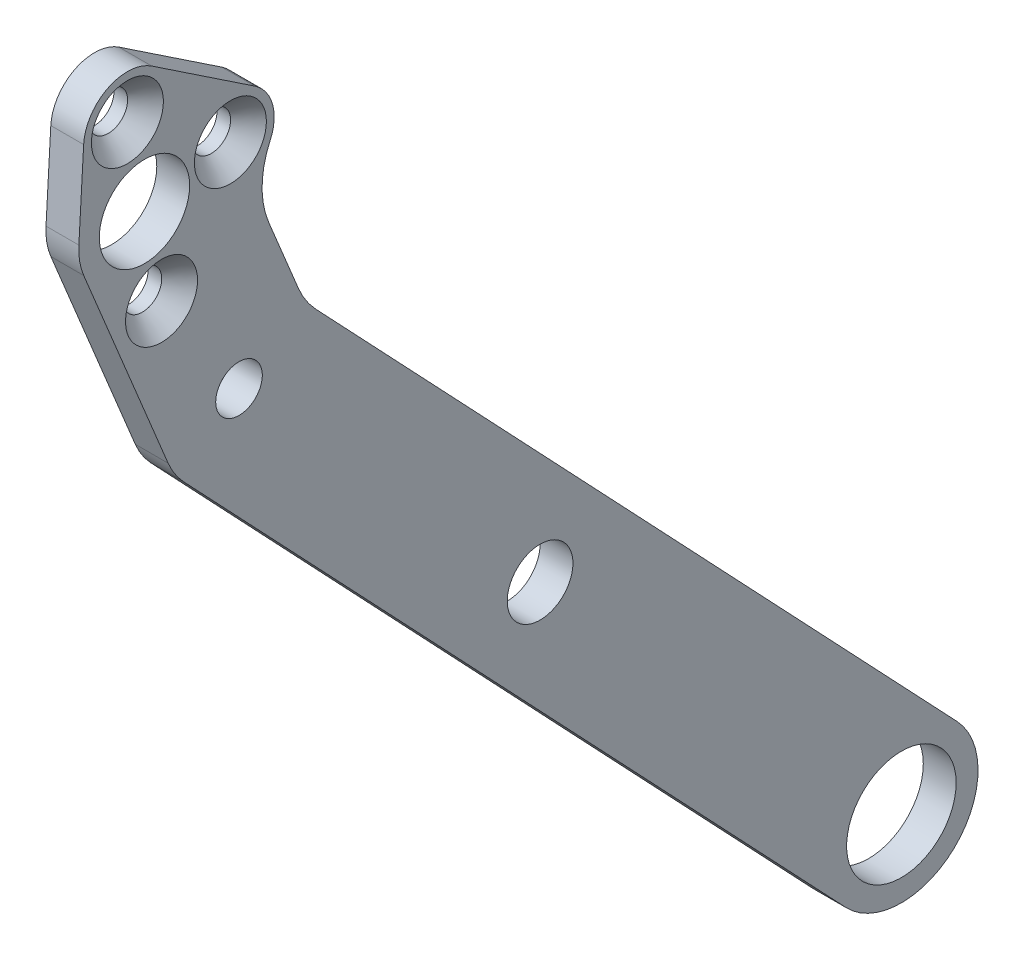
ISO-10303-21;
HEADER;
FILE_DESCRIPTION(('STEP AP214'),'2;1');
FILE_NAME('part.step','',(''),(''),'','','');
FILE_SCHEMA(('AUTOMOTIVE_DESIGN { 1 0 10303 214 1 1 1 1 }'));
ENDSEC;
DATA;
#1=APPLICATION_CONTEXT('core data for automotive mechanical design processes');
#2=APPLICATION_PROTOCOL_DEFINITION('international standard','automotive_design',2000,#1);
#3=PRODUCT_CONTEXT('',#1,'mechanical');
#4=PRODUCT('Part','Part','',(#3));
#5=PRODUCT_RELATED_PRODUCT_CATEGORY('part','',(#4));
#6=PRODUCT_DEFINITION_FORMATION('','',#4);
#7=PRODUCT_DEFINITION_CONTEXT('part definition',#1,'design');
#8=PRODUCT_DEFINITION('design','',#6,#7);
#9=PRODUCT_DEFINITION_SHAPE('','',#8);
#10=(LENGTH_UNIT() NAMED_UNIT(*) SI_UNIT(.MILLI.,.METRE.));
#11=(NAMED_UNIT(*) PLANE_ANGLE_UNIT() SI_UNIT($,.RADIAN.));
#12=(NAMED_UNIT(*) SI_UNIT($,.STERADIAN.) SOLID_ANGLE_UNIT());
#13=UNCERTAINTY_MEASURE_WITH_UNIT(LENGTH_MEASURE(1.E-05),#10,'distance_accuracy_value','');
#14=(GEOMETRIC_REPRESENTATION_CONTEXT(3) GLOBAL_UNCERTAINTY_ASSIGNED_CONTEXT((#13)) GLOBAL_UNIT_ASSIGNED_CONTEXT((#10,
#11,#12)) REPRESENTATION_CONTEXT('',''));
#15=CARTESIAN_POINT('',(0.,0.,0.));
#16=DIRECTION('',(0.,0.,1.));
#17=DIRECTION('',(1.,0.,0.));
#18=AXIS2_PLACEMENT_3D('',#15,#16,#17);
#19=CARTESIAN_POINT('',(27.6416124839999,284.474790159518,1386.39556819334));
#20=DIRECTION('',(1.,0.,0.));
#21=DIRECTION('',(0.,0.,-1.));
#22=AXIS2_PLACEMENT_3D('',#19,#20,#21);
#23=CYLINDRICAL_SURFACE('',#22,11.1124999999999);
#24=CARTESIAN_POINT('',(32.404112484,284.474790159518,1386.39556819334));
#25=DIRECTION('',(1.,0.,0.));
#26=DIRECTION('',(0.,0.,-1.));
#27=AXIS2_PLACEMENT_3D('',#24,#25,#26);
#28=CIRCLE('',#27,11.1124999999999);
#29=CARTESIAN_POINT('',(32.404112484,280.239471359095,1396.66930806297));
#30=VERTEX_POINT('',#29);
#31=CARTESIAN_POINT('',(32.404112484,276.836816997298,1394.46706261651));
#32=VERTEX_POINT('',#31);
#33=EDGE_CURVE('E179',#30,#32,#28,.T.);
#34=ORIENTED_EDGE('',*,*,#33,.F.);
#35=DIRECTION('',(-1.,0.,0.));
#36=VECTOR('',#35,1.);
#37=CARTESIAN_POINT('',(32.404112484,280.239471359095,1396.66930806297));
#38=LINE('',#37,#36);
#39=CARTESIAN_POINT('',(27.6416124839999,280.239471359095,1396.66930806297));
#40=VERTEX_POINT('',#39);
#41=EDGE_CURVE('E263',#30,#40,#38,.T.);
#42=ORIENTED_EDGE('',*,*,#41,.T.);
#43=CARTESIAN_POINT('',(27.6416124839999,284.474790159518,1386.39556819334));
#44=DIRECTION('',(1.,0.,0.));
#45=DIRECTION('',(0.,0.,-1.));
#46=AXIS2_PLACEMENT_3D('',#43,#44,#45);
#47=CIRCLE('',#46,11.1124999999999);
#48=CARTESIAN_POINT('',(27.6416124839999,276.836816997298,1394.46706261651));
#49=VERTEX_POINT('',#48);
#50=EDGE_CURVE('E182',#40,#49,#47,.T.);
#51=ORIENTED_EDGE('',*,*,#50,.T.);
#52=DIRECTION('',(1.,0.,0.));
#53=VECTOR('',#52,1.);
#54=CARTESIAN_POINT('',(27.6416124839999,276.836816997298,1394.46706261651));
#55=LINE('',#54,#53);
#56=EDGE_CURVE('E194',#49,#32,#55,.T.);
#57=ORIENTED_EDGE('',*,*,#56,.T.);
#58=EDGE_LOOP('',(#34,#42,#51,#57));
#59=FACE_BOUND('',#58,.T.);
#60=ADVANCED_FACE('F39',(#59),#23,.T.);
#61=CARTESIAN_POINT('',(27.6416124839999,292.112763321738,1378.32407377017));
#62=DIRECTION('',(0.,0.687331668141309,-0.726343705121815));
#63=DIRECTION('',(0.,0.726343705121815,0.687331668141309));
#64=AXIS2_PLACEMENT_3D('',#61,#62,#63);
#65=PLANE('',#64);
#66=DIRECTION('',(0.,0.726343705121815,0.687331668141309));
#67=VECTOR('',#66,1.);
#68=CARTESIAN_POINT('',(27.6416124839999,292.112763321738,1378.32407377017));
#69=LINE('',#68,#67);
#70=CARTESIAN_POINT('',(27.6416124839999,190.642547716221,1282.30383973083));
#71=VERTEX_POINT('',#70);
#72=CARTESIAN_POINT('',(27.6416124839999,288.90470877819,1375.28832435105));
#73=VERTEX_POINT('',#72);
#74=EDGE_CURVE('E191',#71,#73,#69,.T.);
#75=ORIENTED_EDGE('',*,*,#74,.T.);
#76=DIRECTION('',(-1.,0.,0.));
#77=VECTOR('',#76,1.);
#78=CARTESIAN_POINT('',(27.6416124839999,288.90470877819,1375.28832435105));
#79=LINE('',#78,#77);
#80=CARTESIAN_POINT('',(32.404112484,288.90470877819,1375.28832435105));
#81=VERTEX_POINT('',#80);
#82=EDGE_CURVE('E215',#73,#81,#79,.F.);
#83=ORIENTED_EDGE('',*,*,#82,.T.);
#84=DIRECTION('',(0.,0.726343705121815,0.687331668141309));
#85=VECTOR('',#84,1.);
#86=CARTESIAN_POINT('',(32.404112484,292.112763321738,1378.32407377017));
#87=LINE('',#86,#85);
#88=CARTESIAN_POINT('',(32.404112484,190.642547716221,1282.30383973083));
#89=VERTEX_POINT('',#88);
#90=EDGE_CURVE('E185',#89,#81,#87,.T.);
#91=ORIENTED_EDGE('',*,*,#90,.F.);
#92=DIRECTION('',(1.,0.,0.));
#93=VECTOR('',#92,1.);
#94=CARTESIAN_POINT('',(27.6416124839999,190.642547716221,1282.30383973083));
#95=LINE('',#94,#93);
#96=EDGE_CURVE('E204',#71,#89,#95,.T.);
#97=ORIENTED_EDGE('',*,*,#96,.F.);
#98=EDGE_LOOP('',(#75,#83,#91,#97));
#99=FACE_BOUND('',#98,.T.);
#100=ADVANCED_FACE('F348',(#99),#65,.T.);
#101=CARTESIAN_POINT('',(27.6416124839999,183.004574554,1290.375334154));
#102=DIRECTION('',(1.,0.,0.));
#103=DIRECTION('',(0.,0.,-1.));
#104=AXIS2_PLACEMENT_3D('',#101,#102,#103);
#105=CYLINDRICAL_SURFACE('',#104,11.1124999999998);
#106=CARTESIAN_POINT('',(32.404112484,183.004574554,1290.375334154));
#107=DIRECTION('',(1.,0.,0.));
#108=DIRECTION('',(0.,0.,-1.));
#109=AXIS2_PLACEMENT_3D('',#106,#107,#108);
#110=CIRCLE('',#109,11.1124999999998);
#111=CARTESIAN_POINT('',(32.404112484,175.36660139178,1298.44682857717));
#112=VERTEX_POINT('',#111);
#113=EDGE_CURVE('E199',#112,#89,#110,.T.);
#114=ORIENTED_EDGE('',*,*,#113,.F.);
#115=DIRECTION('',(1.,0.,0.));
#116=VECTOR('',#115,1.);
#117=CARTESIAN_POINT('',(27.6416124839999,175.36660139178,1298.44682857717));
#118=LINE('',#117,#116);
#119=CARTESIAN_POINT('',(27.6416124839999,175.36660139178,1298.44682857717));
#120=VERTEX_POINT('',#119);
#121=EDGE_CURVE('E207',#120,#112,#118,.T.);
#122=ORIENTED_EDGE('',*,*,#121,.F.);
#123=CARTESIAN_POINT('',(27.6416124839999,183.004574554,1290.375334154));
#124=DIRECTION('',(1.,0.,0.));
#125=DIRECTION('',(0.,0.,-1.));
#126=AXIS2_PLACEMENT_3D('',#123,#124,#125);
#127=CIRCLE('',#126,11.1124999999998);
#128=EDGE_CURVE('E188',#120,#71,#127,.T.);
#129=ORIENTED_EDGE('',*,*,#128,.T.);
#130=ORIENTED_EDGE('',*,*,#96,.T.);
#131=EDGE_LOOP('',(#114,#122,#129,#130));
#132=FACE_BOUND('',#131,.T.);
#133=ADVANCED_FACE('F355',(#132),#105,.T.);
#134=CARTESIAN_POINT('',(27.6416124839999,276.836816997298,1394.46706261651));
#135=DIRECTION('',(0.,-0.68733166814131,0.726343705121813));
#136=DIRECTION('',(0.,-0.726343705121813,-0.68733166814131));
#137=AXIS2_PLACEMENT_3D('',#134,#135,#136);
#138=PLANE('',#137);
#139=DIRECTION('',(0.,-0.726343705121813,-0.68733166814131));
#140=VECTOR('',#139,1.);
#141=CARTESIAN_POINT('',(32.404112484,276.836816997298,1394.46706261651));
#142=LINE('',#141,#140);
#143=EDGE_CURVE('E196',#32,#112,#142,.T.);
#144=ORIENTED_EDGE('',*,*,#143,.F.);
#145=ORIENTED_EDGE('',*,*,#56,.F.);
#146=DIRECTION('',(0.,-0.726343705121813,-0.68733166814131));
#147=VECTOR('',#146,1.);
#148=CARTESIAN_POINT('',(27.6416124839999,276.836816997298,1394.46706261651));
#149=LINE('',#148,#147);
#150=EDGE_CURVE('E184',#49,#120,#149,.T.);
#151=ORIENTED_EDGE('',*,*,#150,.T.);
#152=ORIENTED_EDGE('',*,*,#121,.T.);
#153=EDGE_LOOP('',(#144,#145,#151,#152));
#154=FACE_BOUND('',#153,.T.);
#155=ADVANCED_FACE('F281',(#154),#138,.T.);
#156=CARTESIAN_POINT('',(27.6416124839999,284.474790159518,1386.39556819334));
#157=DIRECTION('',(1.,0.,0.));
#158=DIRECTION('',(0.,0.,-1.));
#159=AXIS2_PLACEMENT_3D('',#156,#157,#158);
#160=PLANE('',#159);
#161=CARTESIAN_POINT('',(27.6416124839999,326.011681615142,1402.57547939512));
#162=DIRECTION('',(1.,0.,0.));
#163=DIRECTION('',(0.,0.,-1.));
#164=AXIS2_PLACEMENT_3D('',#161,#162,#163);
#165=CIRCLE('',#164,2.8067);
#166=CARTESIAN_POINT('',(27.6416124839999,326.011681615142,1399.76877939512));
#167=VERTEX_POINT('',#166);
#168=EDGE_CURVE('E309',#167,#167,#165,.T.);
#169=ORIENTED_EDGE('',*,*,#168,.T.);
#170=EDGE_LOOP('',(#169));
#171=FACE_BOUND('',#170,.T.);
#172=CARTESIAN_POINT('',(27.6416124839999,316.029628790421,1387.64435012087));
#173=DIRECTION('',(1.,0.,0.));
#174=DIRECTION('',(0.,0.,-1.));
#175=AXIS2_PLACEMENT_3D('',#172,#173,#174);
#176=CIRCLE('',#175,2.8067);
#177=CARTESIAN_POINT('',(27.6416124839999,316.029628790421,1384.83765012087));
#178=VERTEX_POINT('',#177);
#179=EDGE_CURVE('E300',#178,#178,#176,.T.);
#180=ORIENTED_EDGE('',*,*,#179,.T.);
#181=EDGE_LOOP('',(#180));
#182=FACE_BOUND('',#181,.T.);
#183=CARTESIAN_POINT('',(27.6416124839999,301.098499516167,1397.62640294559));
#184=DIRECTION('',(1.,0.,0.));
#185=DIRECTION('',(0.,0.,-1.));
#186=AXIS2_PLACEMENT_3D('',#183,#184,#185);
#187=CIRCLE('',#186,2.8067);
#188=CARTESIAN_POINT('',(27.6416124839999,301.098499516167,1394.81970294559));
#189=VERTEX_POINT('',#188);
#190=EDGE_CURVE('E291',#189,#189,#187,.T.);
#191=ORIENTED_EDGE('',*,*,#190,.T.);
#192=EDGE_LOOP('',(#191));
#193=FACE_BOUND('',#192,.T.);
#194=CARTESIAN_POINT('',(27.6416124839999,313.555090565655,1400.10094117035));
#195=DIRECTION('',(1.,0.,0.));
#196=DIRECTION('',(0.,0.,-1.));
#197=AXIS2_PLACEMENT_3D('',#194,#195,#196);
#198=CIRCLE('',#197,6.54811999999999);
#199=CARTESIAN_POINT('',(27.6416124839999,313.555090565655,1393.55282117035));
#200=VERTEX_POINT('',#199);
#201=EDGE_CURVE('E254',#200,#200,#198,.T.);
#202=ORIENTED_EDGE('',*,*,#201,.T.);
#203=EDGE_LOOP('',(#202));
#204=FACE_BOUND('',#203,.T.);
#205=ORIENTED_EDGE('',*,*,#50,.F.);
#206=DIRECTION('',(0.,-0.924521023138623,-0.381131050656744));
#207=VECTOR('',#206,1.);
#208=CARTESIAN_POINT('',(27.6416124839999,309.924817308149,1408.90700391575));
#209=LINE('',#208,#207);
#210=CARTESIAN_POINT('',(27.6416124839999,309.924817308149,1408.90700391575));
#211=VERTEX_POINT('',#210);
#212=EDGE_CURVE('E236',#211,#40,#209,.T.);
#213=ORIENTED_EDGE('',*,*,#212,.F.);
#214=CARTESIAN_POINT('',(27.6416124839999,313.555090565655,1400.10094117035));
#215=DIRECTION('',(1.,0.,0.));
#216=DIRECTION('',(0.,0.,-1.));
#217=AXIS2_PLACEMENT_3D('',#214,#215,#216);
#218=CIRCLE('',#217,9.52500000000012);
#219=CARTESIAN_POINT('',(27.6416124839999,314.093730387295,1409.61069890347));
#220=VERTEX_POINT('',#219);
#221=EDGE_CURVE('E256',#220,#211,#218,.T.);
#222=ORIENTED_EDGE('',*,*,#221,.F.);
#223=DIRECTION('',(0.,-0.998399762006842,0.0565501125081203));
#224=VECTOR('',#223,1.);
#225=CARTESIAN_POINT('',(27.6416124839999,326.370774829569,1408.91531788386));
#226=LINE('',#225,#224);
#227=CARTESIAN_POINT('',(27.6416124839999,326.370774829569,1408.91531788386));
#228=VERTEX_POINT('',#227);
#229=EDGE_CURVE('E253',#228,#220,#226,.T.);
#230=ORIENTED_EDGE('',*,*,#229,.F.);
#231=CARTESIAN_POINT('',(27.6416124839999,326.011681615142,1402.57547939512));
#232=DIRECTION('',(1.,0.,0.));
#233=DIRECTION('',(0.,0.,-1.));
#234=AXIS2_PLACEMENT_3D('',#231,#232,#233);
#235=CIRCLE('',#234,6.35000000000012);
#236=CARTESIAN_POINT('',(27.6416124839999,331.290632995441,1399.04629077386));
#237=VERTEX_POINT('',#236);
#238=EDGE_CURVE('E157',#237,#228,#235,.T.);
#239=ORIENTED_EDGE('',*,*,#238,.F.);
#240=DIRECTION('',(0.,0.555777735631678,0.83133092603134));
#241=VECTOR('',#240,1.);
#242=CARTESIAN_POINT('',(27.6416124839999,331.290632995441,1399.04629077386));
#243=LINE('',#242,#241);
#244=CARTESIAN_POINT('',(27.6416124839999,321.30858017072,1384.1151614996));
#245=VERTEX_POINT('',#244);
#246=EDGE_CURVE('E153',#245,#237,#243,.T.);
#247=ORIENTED_EDGE('',*,*,#246,.F.);
#248=CARTESIAN_POINT('',(27.6416124839999,316.029628790421,1387.64435012087));
#249=DIRECTION('',(1.,0.,0.));
#250=DIRECTION('',(0.,0.,-1.));
#251=AXIS2_PLACEMENT_3D('',#248,#249,#250);
#252=CIRCLE('',#251,6.35000000000004);
#253=CARTESIAN_POINT('',(27.6416124839999,313.365306823651,1381.88033342611));
#254=VERTEX_POINT('',#253);
#255=EDGE_CURVE('E231',#254,#245,#252,.T.);
#256=ORIENTED_EDGE('',*,*,#255,.F.);
#257=CARTESIAN_POINT('',(27.6416124839999,308.03666289011,1370.35230003661));
#258=DIRECTION('',(1.,0.,0.));
#259=DIRECTION('',(0.,0.,-1.));
#260=AXIS2_PLACEMENT_3D('',#257,#258,#259);
#261=CIRCLE('',#260,12.7);
#262=CARTESIAN_POINT('',(27.6416124839999,303.196298546769,1382.09371703047));
#263=VERTEX_POINT('',#262);
#264=EDGE_CURVE('E47',#254,#263,#261,.T.);
#265=ORIENTED_EDGE('',*,*,#264,.T.);
#266=DIRECTION('',(0.,0.924521023138621,0.38113105065675));
#267=VECTOR('',#266,1.);
#268=CARTESIAN_POINT('',(27.6416124839999,310.254792893638,1385.00356039709));
#269=LINE('',#268,#267);
#270=CARTESIAN_POINT('',(27.6416124839999,292.793456620244,1377.80517628987));
#271=VERTEX_POINT('',#270);
#272=EDGE_CURVE('E229',#271,#263,#269,.T.);
#273=ORIENTED_EDGE('',*,*,#272,.F.);
#274=CARTESIAN_POINT('',(27.6416124839999,297.633820963585,1366.06375929601));
#275=DIRECTION('',(1.,0.,0.));
#276=DIRECTION('',(0.,0.,-1.));
#277=AXIS2_PLACEMENT_3D('',#274,#275,#276);
#278=CIRCLE('',#277,12.7);
#279=EDGE_CURVE('E219',#271,#73,#278,.T.);
#280=ORIENTED_EDGE('',*,*,#279,.T.);
#281=ORIENTED_EDGE('',*,*,#74,.F.);
#282=ORIENTED_EDGE('',*,*,#128,.F.);
#283=ORIENTED_EDGE('',*,*,#150,.F.);
#284=EDGE_LOOP('',(#205,#213,#222,#230,#239,#247,#256,#265,#273,#280,#281,#282,#283));
#285=FACE_BOUND('',#284,.T.);
#286=CARTESIAN_POINT('',(27.6416124839999,238.351964884283,1342.75000726637));
#287=DIRECTION('',(1.,0.,0.));
#288=DIRECTION('',(0.,0.,-1.));
#289=AXIS2_PLACEMENT_3D('',#286,#287,#288);
#290=CIRCLE('',#289,4.7624999999999);
#291=CARTESIAN_POINT('',(27.6416124839999,238.351964884283,1337.98750726637));
#292=VERTEX_POINT('',#291);
#293=EDGE_CURVE('E161',#292,#292,#290,.F.);
#294=ORIENTED_EDGE('',*,*,#293,.F.);
#295=EDGE_LOOP('',(#294));
#296=FACE_BOUND('',#295,.T.);
#297=CARTESIAN_POINT('',(27.6416124839999,284.474790159518,1386.39556819334));
#298=DIRECTION('',(-1.,0.,0.));
#299=DIRECTION('',(0.,0.,1.));
#300=AXIS2_PLACEMENT_3D('',#297,#298,#299);
#301=CIRCLE('',#300,3.3782);
#302=CARTESIAN_POINT('',(27.6416124839999,284.474790159518,1389.77376819334));
#303=VERTEX_POINT('',#302);
#304=EDGE_CURVE('E169',#303,#303,#301,.T.);
#305=ORIENTED_EDGE('',*,*,#304,.F.);
#306=EDGE_LOOP('',(#305));
#307=FACE_BOUND('',#306,.T.);
#308=CARTESIAN_POINT('',(27.6416124839999,183.004574554,1290.375334154));
#309=DIRECTION('',(1.,0.,0.));
#310=DIRECTION('',(0.,0.,-1.));
#311=AXIS2_PLACEMENT_3D('',#308,#309,#310);
#312=CIRCLE('',#311,7.93749999999998);
#313=CARTESIAN_POINT('',(27.6416124839999,183.004574554,1282.437834154));
#314=VERTEX_POINT('',#313);
#315=EDGE_CURVE('E176',#314,#314,#312,.T.);
#316=ORIENTED_EDGE('',*,*,#315,.T.);
#317=EDGE_LOOP('',(#316));
#318=FACE_BOUND('',#317,.T.);
#319=ADVANCED_FACE('F227',(#171,#182,#193,#204,#285,#296,#307,#318),#160,.F.);
#320=CARTESIAN_POINT('',(32.404112484,284.474790159518,1386.39556819334));
#321=DIRECTION('',(1.,0.,0.));
#322=DIRECTION('',(0.,0.,-1.));
#323=AXIS2_PLACEMENT_3D('',#320,#321,#322);
#324=PLANE('',#323);
#325=CARTESIAN_POINT('',(32.404112484,326.011681615142,1402.57547939512));
#326=DIRECTION('',(1.,0.,0.));
#327=DIRECTION('',(0.,0.,-1.));
#328=AXIS2_PLACEMENT_3D('',#325,#326,#327);
#329=CIRCLE('',#328,5.21969999999999);
#330=CARTESIAN_POINT('',(32.404112484,326.011681615142,1397.35577939512));
#331=VERTEX_POINT('',#330);
#332=EDGE_CURVE('E315',#331,#331,#329,.T.);
#333=ORIENTED_EDGE('',*,*,#332,.F.);
#334=EDGE_LOOP('',(#333));
#335=FACE_BOUND('',#334,.T.);
#336=CARTESIAN_POINT('',(32.404112484,316.029628790421,1387.64435012087));
#337=DIRECTION('',(1.,0.,0.));
#338=DIRECTION('',(0.,0.,-1.));
#339=AXIS2_PLACEMENT_3D('',#336,#337,#338);
#340=CIRCLE('',#339,5.21969999999999);
#341=CARTESIAN_POINT('',(32.404112484,316.029628790421,1382.42465012087));
#342=VERTEX_POINT('',#341);
#343=EDGE_CURVE('E306',#342,#342,#340,.T.);
#344=ORIENTED_EDGE('',*,*,#343,.F.);
#345=EDGE_LOOP('',(#344));
#346=FACE_BOUND('',#345,.T.);
#347=CARTESIAN_POINT('',(32.404112484,301.098499516167,1397.62640294559));
#348=DIRECTION('',(1.,0.,0.));
#349=DIRECTION('',(0.,0.,-1.));
#350=AXIS2_PLACEMENT_3D('',#347,#348,#349);
#351=CIRCLE('',#350,5.21969999999999);
#352=CARTESIAN_POINT('',(32.404112484,301.098499516167,1392.40670294559));
#353=VERTEX_POINT('',#352);
#354=EDGE_CURVE('E297',#353,#353,#351,.T.);
#355=ORIENTED_EDGE('',*,*,#354,.F.);
#356=EDGE_LOOP('',(#355));
#357=FACE_BOUND('',#356,.T.);
#358=CARTESIAN_POINT('',(32.404112484,313.555090565655,1400.10094117035));
#359=DIRECTION('',(1.,0.,0.));
#360=DIRECTION('',(0.,0.,-1.));
#361=AXIS2_PLACEMENT_3D('',#358,#359,#360);
#362=CIRCLE('',#361,6.54811999999999);
#363=CARTESIAN_POINT('',(32.404112484,313.555090565655,1393.55282117035));
#364=VERTEX_POINT('',#363);
#365=EDGE_CURVE('E288',#364,#364,#362,.T.);
#366=ORIENTED_EDGE('',*,*,#365,.F.);
#367=EDGE_LOOP('',(#366));
#368=FACE_BOUND('',#367,.T.);
#369=DIRECTION('',(0.,-0.924521023138623,-0.381131050656744));
#370=VECTOR('',#369,1.);
#371=CARTESIAN_POINT('',(32.404112484,309.924817308149,1408.90700391575));
#372=LINE('',#371,#370);
#373=CARTESIAN_POINT('',(32.404112484,309.924817308149,1408.90700391575));
#374=VERTEX_POINT('',#373);
#375=EDGE_CURVE('E248',#374,#30,#372,.T.);
#376=ORIENTED_EDGE('',*,*,#375,.T.);
#377=ORIENTED_EDGE('',*,*,#33,.T.);
#378=ORIENTED_EDGE('',*,*,#143,.T.);
#379=ORIENTED_EDGE('',*,*,#113,.T.);
#380=ORIENTED_EDGE('',*,*,#90,.T.);
#381=CARTESIAN_POINT('',(32.404112484,297.633820963585,1366.06375929601));
#382=DIRECTION('',(1.,0.,0.));
#383=DIRECTION('',(0.,0.,-1.));
#384=AXIS2_PLACEMENT_3D('',#381,#382,#383);
#385=CIRCLE('',#384,12.7);
#386=CARTESIAN_POINT('',(32.404112484,292.793456620244,1377.80517628987));
#387=VERTEX_POINT('',#386);
#388=EDGE_CURVE('E221',#81,#387,#385,.F.);
#389=ORIENTED_EDGE('',*,*,#388,.T.);
#390=DIRECTION('',(0.,0.924521023138621,0.38113105065675));
#391=VECTOR('',#390,1.);
#392=CARTESIAN_POINT('',(32.404112484,310.254792893638,1385.00356039709));
#393=LINE('',#392,#391);
#394=CARTESIAN_POINT('',(32.404112484,303.196298546769,1382.09371703047));
#395=VERTEX_POINT('',#394);
#396=EDGE_CURVE('E244',#387,#395,#393,.T.);
#397=ORIENTED_EDGE('',*,*,#396,.T.);
#398=CARTESIAN_POINT('',(32.404112484,308.03666289011,1370.35230003661));
#399=DIRECTION('',(1.,0.,0.));
#400=DIRECTION('',(0.,0.,-1.));
#401=AXIS2_PLACEMENT_3D('',#398,#399,#400);
#402=CIRCLE('',#401,12.7);
#403=CARTESIAN_POINT('',(32.404112484,313.365306823651,1381.88033342611));
#404=VERTEX_POINT('',#403);
#405=EDGE_CURVE('E11',#395,#404,#402,.F.);
#406=ORIENTED_EDGE('',*,*,#405,.T.);
#407=CARTESIAN_POINT('',(32.404112484,316.029628790421,1387.64435012087));
#408=DIRECTION('',(1.,0.,0.));
#409=DIRECTION('',(0.,0.,-1.));
#410=AXIS2_PLACEMENT_3D('',#407,#408,#409);
#411=CIRCLE('',#410,6.35000000000004);
#412=CARTESIAN_POINT('',(32.404112484,321.30858017072,1384.1151614996));
#413=VERTEX_POINT('',#412);
#414=EDGE_CURVE('E242',#404,#413,#411,.T.);
#415=ORIENTED_EDGE('',*,*,#414,.T.);
#416=DIRECTION('',(0.,0.555777735631678,0.83133092603134));
#417=VECTOR('',#416,1.);
#418=CARTESIAN_POINT('',(32.404112484,331.290632995441,1399.04629077386));
#419=LINE('',#418,#417);
#420=CARTESIAN_POINT('',(32.404112484,331.290632995441,1399.04629077386));
#421=VERTEX_POINT('',#420);
#422=EDGE_CURVE('E149',#413,#421,#419,.T.);
#423=ORIENTED_EDGE('',*,*,#422,.T.);
#424=CARTESIAN_POINT('',(32.404112484,326.011681615142,1402.57547939512));
#425=DIRECTION('',(1.,0.,0.));
#426=DIRECTION('',(0.,0.,-1.));
#427=AXIS2_PLACEMENT_3D('',#424,#425,#426);
#428=CIRCLE('',#427,6.35000000000012);
#429=CARTESIAN_POINT('',(32.404112484,326.370774829569,1408.91531788386));
#430=VERTEX_POINT('',#429);
#431=EDGE_CURVE('E143',#421,#430,#428,.T.);
#432=ORIENTED_EDGE('',*,*,#431,.T.);
#433=DIRECTION('',(0.,-0.998399762006842,0.0565501125081203));
#434=VECTOR('',#433,1.);
#435=CARTESIAN_POINT('',(32.404112484,326.370774829569,1408.91531788386));
#436=LINE('',#435,#434);
#437=CARTESIAN_POINT('',(32.404112484,314.093730387295,1409.61069890347));
#438=VERTEX_POINT('',#437);
#439=EDGE_CURVE('E133',#430,#438,#436,.T.);
#440=ORIENTED_EDGE('',*,*,#439,.T.);
#441=CARTESIAN_POINT('',(32.404112484,313.555090565655,1400.10094117035));
#442=DIRECTION('',(1.,0.,0.));
#443=DIRECTION('',(0.,0.,-1.));
#444=AXIS2_PLACEMENT_3D('',#441,#442,#443);
#445=CIRCLE('',#444,9.52500000000012);
#446=EDGE_CURVE('E142',#438,#374,#445,.T.);
#447=ORIENTED_EDGE('',*,*,#446,.T.);
#448=EDGE_LOOP('',(#376,#377,#378,#379,#380,#389,#397,#406,#415,#423,#432,#440,#447));
#449=FACE_BOUND('',#448,.T.);
#450=CARTESIAN_POINT('',(32.404112484,238.351964884283,1342.75000726637));
#451=DIRECTION('',(1.,0.,0.));
#452=DIRECTION('',(0.,0.,-1.));
#453=AXIS2_PLACEMENT_3D('',#450,#451,#452);
#454=CIRCLE('',#453,4.7624999999999);
#455=CARTESIAN_POINT('',(32.404112484,238.351964884283,1337.98750726637));
#456=VERTEX_POINT('',#455);
#457=EDGE_CURVE('E158',#456,#456,#454,.T.);
#458=ORIENTED_EDGE('',*,*,#457,.F.);
#459=EDGE_LOOP('',(#458));
#460=FACE_BOUND('',#459,.T.);
#461=CARTESIAN_POINT('',(32.404112484,284.474790159518,1386.39556819334));
#462=DIRECTION('',(-1.,0.,0.));
#463=DIRECTION('',(0.,0.,1.));
#464=AXIS2_PLACEMENT_3D('',#461,#462,#463);
#465=CIRCLE('',#464,3.3782);
#466=CARTESIAN_POINT('',(32.404112484,284.474790159518,1389.77376819334));
#467=VERTEX_POINT('',#466);
#468=EDGE_CURVE('E172',#467,#467,#465,.T.);
#469=ORIENTED_EDGE('',*,*,#468,.T.);
#470=EDGE_LOOP('',(#469));
#471=FACE_BOUND('',#470,.T.);
#472=CARTESIAN_POINT('',(32.404112484,183.004574554,1290.375334154));
#473=DIRECTION('',(1.,0.,0.));
#474=DIRECTION('',(0.,0.,-1.));
#475=AXIS2_PLACEMENT_3D('',#472,#473,#474);
#476=CIRCLE('',#475,7.93749999999998);
#477=CARTESIAN_POINT('',(32.404112484,183.004574554,1282.437834154));
#478=VERTEX_POINT('',#477);
#479=EDGE_CURVE('E175',#478,#478,#476,.T.);
#480=ORIENTED_EDGE('',*,*,#479,.F.);
#481=EDGE_LOOP('',(#480));
#482=FACE_BOUND('',#481,.T.);
#483=ADVANCED_FACE('F146',(#335,#346,#357,#368,#449,#460,#471,#482),#324,.T.);
#484=CARTESIAN_POINT('',(27.6416124839999,183.004574554,1290.375334154));
#485=DIRECTION('',(1.,0.,0.));
#486=DIRECTION('',(0.,0.,-1.));
#487=AXIS2_PLACEMENT_3D('',#484,#485,#486);
#488=CYLINDRICAL_SURFACE('',#487,7.93749999999998);
#489=ORIENTED_EDGE('',*,*,#315,.F.);
#490=EDGE_LOOP('',(#489));
#491=FACE_BOUND('',#490,.T.);
#492=ORIENTED_EDGE('',*,*,#479,.T.);
#493=EDGE_LOOP('',(#492));
#494=FACE_BOUND('',#493,.T.);
#495=ADVANCED_FACE('F323',(#491,#494),#488,.F.);
#496=CARTESIAN_POINT('',(27.6416124839999,284.474790159518,1386.39556819334));
#497=DIRECTION('',(-1.,0.,0.));
#498=DIRECTION('',(0.,0.,1.));
#499=AXIS2_PLACEMENT_3D('',#496,#497,#498);
#500=CYLINDRICAL_SURFACE('',#499,3.3782);
#501=ORIENTED_EDGE('',*,*,#468,.F.);
#502=EDGE_LOOP('',(#501));
#503=FACE_BOUND('',#502,.T.);
#504=ORIENTED_EDGE('',*,*,#304,.T.);
#505=EDGE_LOOP('',(#504));
#506=FACE_BOUND('',#505,.T.);
#507=ADVANCED_FACE('F385',(#503,#506),#500,.F.);
#508=CARTESIAN_POINT('',(27.6416124839999,238.351964884283,1342.75000726637));
#509=DIRECTION('',(-1.,0.,0.));
#510=DIRECTION('',(0.,0.,1.));
#511=AXIS2_PLACEMENT_3D('',#508,#509,#510);
#512=CYLINDRICAL_SURFACE('',#511,4.7624999999999);
#513=ORIENTED_EDGE('',*,*,#457,.T.);
#514=EDGE_LOOP('',(#513));
#515=FACE_BOUND('',#514,.T.);
#516=ORIENTED_EDGE('',*,*,#293,.T.);
#517=EDGE_LOOP('',(#516));
#518=FACE_BOUND('',#517,.T.);
#519=ADVANCED_FACE('F389',(#515,#518),#512,.F.);
#520=CARTESIAN_POINT('',(32.404112484,326.011681615142,1402.57547939512));
#521=DIRECTION('',(-1.,0.,0.));
#522=DIRECTION('',(0.,0.,1.));
#523=AXIS2_PLACEMENT_3D('',#520,#521,#522);
#524=CYLINDRICAL_SURFACE('',#523,6.35000000000012);
#525=ORIENTED_EDGE('',*,*,#238,.T.);
#526=DIRECTION('',(-1.,0.,0.));
#527=VECTOR('',#526,1.);
#528=CARTESIAN_POINT('',(32.404112484,326.370774829569,1408.91531788386));
#529=LINE('',#528,#527);
#530=EDGE_CURVE('E137',#430,#228,#529,.T.);
#531=ORIENTED_EDGE('',*,*,#530,.F.);
#532=ORIENTED_EDGE('',*,*,#431,.F.);
#533=DIRECTION('',(-1.,0.,0.));
#534=VECTOR('',#533,1.);
#535=CARTESIAN_POINT('',(32.404112484,331.290632995441,1399.04629077386));
#536=LINE('',#535,#534);
#537=EDGE_CURVE('E246',#421,#237,#536,.T.);
#538=ORIENTED_EDGE('',*,*,#537,.T.);
#539=EDGE_LOOP('',(#525,#531,#532,#538));
#540=FACE_BOUND('',#539,.T.);
#541=ADVANCED_FACE('F155',(#540),#524,.T.);
#542=CARTESIAN_POINT('',(32.404112484,326.370774829569,1408.91531788386));
#543=DIRECTION('',(0.,-0.0565501125081203,-0.998399762006842));
#544=DIRECTION('',(0.,0.998399762006842,-0.0565501125081203));
#545=AXIS2_PLACEMENT_3D('',#542,#543,#544);
#546=PLANE('',#545);
#547=ORIENTED_EDGE('',*,*,#229,.T.);
#548=DIRECTION('',(-1.,0.,0.));
#549=VECTOR('',#548,1.);
#550=CARTESIAN_POINT('',(32.404112484,314.093730387295,1409.61069890347));
#551=LINE('',#550,#549);
#552=EDGE_CURVE('E140',#438,#220,#551,.T.);
#553=ORIENTED_EDGE('',*,*,#552,.F.);
#554=ORIENTED_EDGE('',*,*,#439,.F.);
#555=ORIENTED_EDGE('',*,*,#530,.T.);
#556=EDGE_LOOP('',(#547,#553,#554,#555));
#557=FACE_BOUND('',#556,.T.);
#558=ADVANCED_FACE('F135',(#557),#546,.F.);
#559=CARTESIAN_POINT('',(32.404112484,313.555090565655,1400.10094117035));
#560=DIRECTION('',(-1.,0.,0.));
#561=DIRECTION('',(0.,0.,1.));
#562=AXIS2_PLACEMENT_3D('',#559,#560,#561);
#563=CYLINDRICAL_SURFACE('',#562,9.52500000000012);
#564=ORIENTED_EDGE('',*,*,#221,.T.);
#565=DIRECTION('',(-1.,0.,0.));
#566=VECTOR('',#565,1.);
#567=CARTESIAN_POINT('',(32.404112484,309.924817308149,1408.90700391575));
#568=LINE('',#567,#566);
#569=EDGE_CURVE('E163',#374,#211,#568,.T.);
#570=ORIENTED_EDGE('',*,*,#569,.F.);
#571=ORIENTED_EDGE('',*,*,#446,.F.);
#572=ORIENTED_EDGE('',*,*,#552,.T.);
#573=EDGE_LOOP('',(#564,#570,#571,#572));
#574=FACE_BOUND('',#573,.T.);
#575=ADVANCED_FACE('F396',(#574),#563,.T.);
#576=CARTESIAN_POINT('',(32.404112484,309.924817308149,1408.90700391575));
#577=DIRECTION('',(0.,0.381131050656744,-0.924521023138623));
#578=DIRECTION('',(0.,0.924521023138623,0.381131050656744));
#579=AXIS2_PLACEMENT_3D('',#576,#577,#578);
#580=PLANE('',#579);
#581=ORIENTED_EDGE('',*,*,#212,.T.);
#582=ORIENTED_EDGE('',*,*,#41,.F.);
#583=ORIENTED_EDGE('',*,*,#375,.F.);
#584=ORIENTED_EDGE('',*,*,#569,.T.);
#585=EDGE_LOOP('',(#581,#582,#583,#584));
#586=FACE_BOUND('',#585,.T.);
#587=ADVANCED_FACE('F270',(#586),#580,.F.);
#588=CARTESIAN_POINT('',(32.404112484,310.254792893638,1385.00356039709));
#589=DIRECTION('',(0.,-0.38113105065675,0.924521023138621));
#590=DIRECTION('',(0.,-0.924521023138621,-0.38113105065675));
#591=AXIS2_PLACEMENT_3D('',#588,#589,#590);
#592=PLANE('',#591);
#593=ORIENTED_EDGE('',*,*,#396,.F.);
#594=DIRECTION('',(-1.,0.,0.));
#595=VECTOR('',#594,1.);
#596=CARTESIAN_POINT('',(32.404112484,292.793456620244,1377.80517628987));
#597=LINE('',#596,#595);
#598=EDGE_CURVE('E212',#387,#271,#597,.T.);
#599=ORIENTED_EDGE('',*,*,#598,.T.);
#600=ORIENTED_EDGE('',*,*,#272,.T.);
#601=DIRECTION('',(1.,0.,0.));
#602=VECTOR('',#601,1.);
#603=CARTESIAN_POINT('',(32.404112484,303.196298546769,1382.09371703047));
#604=LINE('',#603,#602);
#605=EDGE_CURVE('E206',#263,#395,#604,.T.);
#606=ORIENTED_EDGE('',*,*,#605,.T.);
#607=EDGE_LOOP('',(#593,#599,#600,#606));
#608=FACE_BOUND('',#607,.T.);
#609=ADVANCED_FACE('F234',(#608),#592,.F.);
#610=CARTESIAN_POINT('',(32.404112484,316.029628790421,1387.64435012087));
#611=DIRECTION('',(-1.,0.,0.));
#612=DIRECTION('',(0.,0.,1.));
#613=AXIS2_PLACEMENT_3D('',#610,#611,#612);
#614=CYLINDRICAL_SURFACE('',#613,6.35000000000004);
#615=ORIENTED_EDGE('',*,*,#414,.F.);
#616=DIRECTION('',(-1.,0.,0.));
#617=VECTOR('',#616,1.);
#618=CARTESIAN_POINT('',(32.404112484,313.365306823651,1381.88033342611));
#619=LINE('',#618,#617);
#620=EDGE_CURVE('E217',#404,#254,#619,.T.);
#621=ORIENTED_EDGE('',*,*,#620,.T.);
#622=ORIENTED_EDGE('',*,*,#255,.T.);
#623=DIRECTION('',(-1.,0.,0.));
#624=VECTOR('',#623,1.);
#625=CARTESIAN_POINT('',(32.404112484,321.30858017072,1384.1151614996));
#626=LINE('',#625,#624);
#627=EDGE_CURVE('E243',#413,#245,#626,.T.);
#628=ORIENTED_EDGE('',*,*,#627,.F.);
#629=EDGE_LOOP('',(#615,#621,#622,#628));
#630=FACE_BOUND('',#629,.T.);
#631=ADVANCED_FACE('F239',(#630),#614,.T.);
#632=CARTESIAN_POINT('',(32.404112484,331.290632995441,1399.04629077386));
#633=DIRECTION('',(0.,-0.83133092603134,0.555777735631678));
#634=DIRECTION('',(0.,-0.555777735631678,-0.83133092603134));
#635=AXIS2_PLACEMENT_3D('',#632,#633,#634);
#636=PLANE('',#635);
#637=ORIENTED_EDGE('',*,*,#246,.T.);
#638=ORIENTED_EDGE('',*,*,#537,.F.);
#639=ORIENTED_EDGE('',*,*,#422,.F.);
#640=ORIENTED_EDGE('',*,*,#627,.T.);
#641=EDGE_LOOP('',(#637,#638,#639,#640));
#642=FACE_BOUND('',#641,.T.);
#643=ADVANCED_FACE('F334',(#642),#636,.F.);
#644=CARTESIAN_POINT('',(32.404112484,313.555090565655,1400.10094117035));
#645=DIRECTION('',(1.,0.,0.));
#646=DIRECTION('',(0.,0.,-1.));
#647=AXIS2_PLACEMENT_3D('',#644,#645,#646);
#648=CYLINDRICAL_SURFACE('',#647,6.54811999999999);
#649=ORIENTED_EDGE('',*,*,#201,.F.);
#650=EDGE_LOOP('',(#649));
#651=FACE_BOUND('',#650,.T.);
#652=ORIENTED_EDGE('',*,*,#365,.T.);
#653=EDGE_LOOP('',(#652));
#654=FACE_BOUND('',#653,.T.);
#655=ADVANCED_FACE('F331',(#651,#654),#648,.F.);
#656=CARTESIAN_POINT('',(32.404112484,301.098499516167,1397.62640294559));
#657=DIRECTION('',(1.,0.,0.));
#658=DIRECTION('',(0.,0.,-1.));
#659=AXIS2_PLACEMENT_3D('',#656,#657,#658);
#660=CYLINDRICAL_SURFACE('',#659,2.8067);
#661=ORIENTED_EDGE('',*,*,#190,.F.);
#662=EDGE_LOOP('',(#661));
#663=FACE_BOUND('',#662,.T.);
#664=CARTESIAN_POINT('',(29.6282735173757,301.098499516167,1397.62640294559));
#665=DIRECTION('',(1.,0.,0.));
#666=DIRECTION('',(0.,0.,-1.));
#667=AXIS2_PLACEMENT_3D('',#664,#665,#666);
#668=CIRCLE('',#667,2.8067);
#669=CARTESIAN_POINT('',(29.6282735173757,301.098499516167,1394.81970294559));
#670=VERTEX_POINT('',#669);
#671=EDGE_CURVE('E294',#670,#670,#668,.T.);
#672=ORIENTED_EDGE('',*,*,#671,.T.);
#673=EDGE_LOOP('',(#672));
#674=FACE_BOUND('',#673,.T.);
#675=ADVANCED_FACE('F333',(#663,#674),#660,.F.);
#676=CARTESIAN_POINT('',(32.404112484,301.098499516167,1397.62640294559));
#677=DIRECTION('',(1.,0.,0.));
#678=DIRECTION('',(0.,0.,-1.));
#679=AXIS2_PLACEMENT_3D('',#676,#677,#678);
#680=CONICAL_SURFACE('',#679,5.21969999999999,0.715584993317675);
#681=ORIENTED_EDGE('',*,*,#671,.F.);
#682=EDGE_LOOP('',(#681));
#683=FACE_BOUND('',#682,.T.);
#684=ORIENTED_EDGE('',*,*,#354,.T.);
#685=EDGE_LOOP('',(#684));
#686=FACE_BOUND('',#685,.T.);
#687=ADVANCED_FACE('F341',(#683,#686),#680,.F.);
#688=CARTESIAN_POINT('',(32.404112484,316.029628790421,1387.64435012087));
#689=DIRECTION('',(1.,0.,0.));
#690=DIRECTION('',(0.,0.,-1.));
#691=AXIS2_PLACEMENT_3D('',#688,#689,#690);
#692=CYLINDRICAL_SURFACE('',#691,2.8067);
#693=ORIENTED_EDGE('',*,*,#179,.F.);
#694=EDGE_LOOP('',(#693));
#695=FACE_BOUND('',#694,.T.);
#696=CARTESIAN_POINT('',(29.6282735173757,316.029628790421,1387.64435012087));
#697=DIRECTION('',(1.,0.,0.));
#698=DIRECTION('',(0.,0.,-1.));
#699=AXIS2_PLACEMENT_3D('',#696,#697,#698);
#700=CIRCLE('',#699,2.8067);
#701=CARTESIAN_POINT('',(29.6282735173757,316.029628790421,1384.83765012087));
#702=VERTEX_POINT('',#701);
#703=EDGE_CURVE('E303',#702,#702,#700,.T.);
#704=ORIENTED_EDGE('',*,*,#703,.T.);
#705=EDGE_LOOP('',(#704));
#706=FACE_BOUND('',#705,.T.);
#707=ADVANCED_FACE('F450',(#695,#706),#692,.F.);
#708=CARTESIAN_POINT('',(32.404112484,316.029628790421,1387.64435012087));
#709=DIRECTION('',(1.,0.,0.));
#710=DIRECTION('',(0.,0.,-1.));
#711=AXIS2_PLACEMENT_3D('',#708,#709,#710);
#712=CONICAL_SURFACE('',#711,5.21969999999999,0.715584993317675);
#713=ORIENTED_EDGE('',*,*,#703,.F.);
#714=EDGE_LOOP('',(#713));
#715=FACE_BOUND('',#714,.T.);
#716=ORIENTED_EDGE('',*,*,#343,.T.);
#717=EDGE_LOOP('',(#716));
#718=FACE_BOUND('',#717,.T.);
#719=ADVANCED_FACE('F441',(#715,#718),#712,.F.);
#720=CARTESIAN_POINT('',(32.404112484,326.011681615142,1402.57547939512));
#721=DIRECTION('',(1.,0.,0.));
#722=DIRECTION('',(0.,0.,-1.));
#723=AXIS2_PLACEMENT_3D('',#720,#721,#722);
#724=CYLINDRICAL_SURFACE('',#723,2.8067);
#725=ORIENTED_EDGE('',*,*,#168,.F.);
#726=EDGE_LOOP('',(#725));
#727=FACE_BOUND('',#726,.T.);
#728=CARTESIAN_POINT('',(29.6282735173757,326.011681615142,1402.57547939512));
#729=DIRECTION('',(1.,0.,0.));
#730=DIRECTION('',(0.,0.,-1.));
#731=AXIS2_PLACEMENT_3D('',#728,#729,#730);
#732=CIRCLE('',#731,2.8067);
#733=CARTESIAN_POINT('',(29.6282735173757,326.011681615142,1399.76877939512));
#734=VERTEX_POINT('',#733);
#735=EDGE_CURVE('E312',#734,#734,#732,.T.);
#736=ORIENTED_EDGE('',*,*,#735,.T.);
#737=EDGE_LOOP('',(#736));
#738=FACE_BOUND('',#737,.T.);
#739=ADVANCED_FACE('F368',(#727,#738),#724,.F.);
#740=CARTESIAN_POINT('',(32.404112484,326.011681615142,1402.57547939512));
#741=DIRECTION('',(1.,0.,0.));
#742=DIRECTION('',(0.,0.,-1.));
#743=AXIS2_PLACEMENT_3D('',#740,#741,#742);
#744=CONICAL_SURFACE('',#743,5.21969999999999,0.715584993317675);
#745=ORIENTED_EDGE('',*,*,#735,.F.);
#746=EDGE_LOOP('',(#745));
#747=FACE_BOUND('',#746,.T.);
#748=ORIENTED_EDGE('',*,*,#332,.T.);
#749=EDGE_LOOP('',(#748));
#750=FACE_BOUND('',#749,.T.);
#751=ADVANCED_FACE('F319',(#747,#750),#744,.F.);
#752=CARTESIAN_POINT('',(32.404112484,297.633820963585,1366.06375929601));
#753=DIRECTION('',(-1.,0.,0.));
#754=DIRECTION('',(0.,0.,1.));
#755=AXIS2_PLACEMENT_3D('',#752,#753,#754);
#756=CYLINDRICAL_SURFACE('',#755,12.7);
#757=ORIENTED_EDGE('',*,*,#388,.F.);
#758=ORIENTED_EDGE('',*,*,#82,.F.);
#759=ORIENTED_EDGE('',*,*,#279,.F.);
#760=ORIENTED_EDGE('',*,*,#598,.F.);
#761=EDGE_LOOP('',(#757,#758,#759,#760));
#762=FACE_BOUND('',#761,.T.);
#763=ADVANCED_FACE('F360',(#762),#756,.F.);
#764=CARTESIAN_POINT('',(32.404112484,308.03666289011,1370.35230003661));
#765=DIRECTION('',(-1.,0.,0.));
#766=DIRECTION('',(0.,0.,1.));
#767=AXIS2_PLACEMENT_3D('',#764,#765,#766);
#768=CYLINDRICAL_SURFACE('',#767,12.7);
#769=ORIENTED_EDGE('',*,*,#405,.F.);
#770=ORIENTED_EDGE('',*,*,#605,.F.);
#771=ORIENTED_EDGE('',*,*,#264,.F.);
#772=ORIENTED_EDGE('',*,*,#620,.F.);
#773=EDGE_LOOP('',(#769,#770,#771,#772));
#774=FACE_BOUND('',#773,.T.);
#775=ADVANCED_FACE('F41',(#774),#768,.F.);
#776=CLOSED_SHELL('',(#60,#100,#133,#155,#319,#483,#495,#507,#519,#541,#558,#575,#587,#609,#631,
#643,#655,#675,#687,#707,#719,#739,#751,#763,#775));
#777=MANIFOLD_SOLID_BREP('B2',#776);
#778=ADVANCED_BREP_SHAPE_REPRESENTATION('',(#18,#777),#14);
#779=SHAPE_DEFINITION_REPRESENTATION(#9,#778);
ENDSEC;
END-ISO-10303-21;
